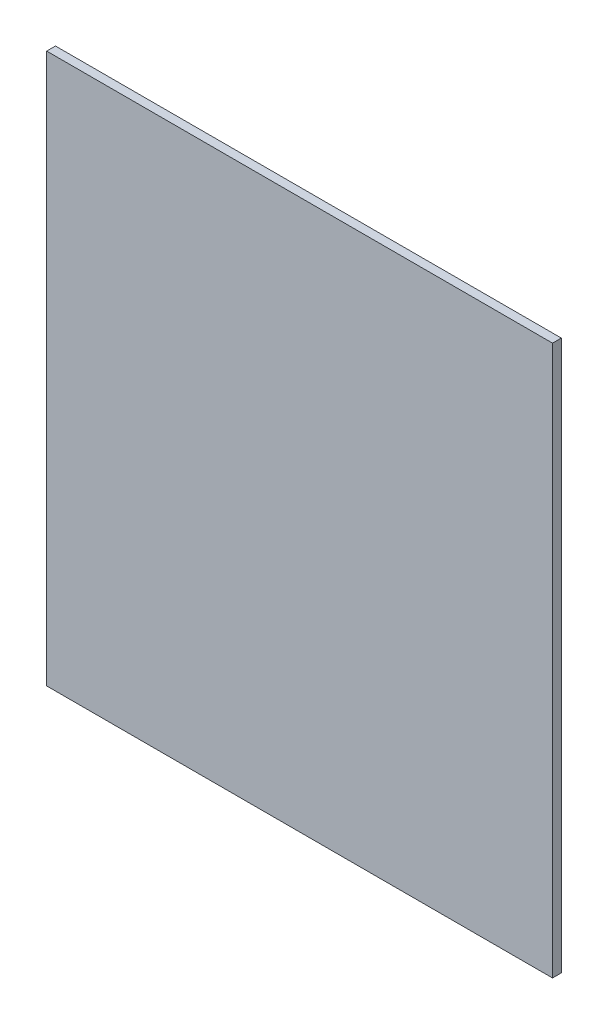
ISO-10303-21;
HEADER;
FILE_DESCRIPTION(('STEP AP214'),'2;1');
FILE_NAME('part.step','',(''),(''),'','','');
FILE_SCHEMA(('AUTOMOTIVE_DESIGN { 1 0 10303 214 1 1 1 1 }'));
ENDSEC;
DATA;
#1=APPLICATION_CONTEXT('core data for automotive mechanical design processes');
#2=APPLICATION_PROTOCOL_DEFINITION('international standard','automotive_design',2000,#1);
#3=PRODUCT_CONTEXT('',#1,'mechanical');
#4=PRODUCT('Part','Part','',(#3));
#5=PRODUCT_RELATED_PRODUCT_CATEGORY('part','',(#4));
#6=PRODUCT_DEFINITION_FORMATION('','',#4);
#7=PRODUCT_DEFINITION_CONTEXT('part definition',#1,'design');
#8=PRODUCT_DEFINITION('design','',#6,#7);
#9=PRODUCT_DEFINITION_SHAPE('','',#8);
#10=(LENGTH_UNIT() NAMED_UNIT(*) SI_UNIT(.MILLI.,.METRE.));
#11=(NAMED_UNIT(*) PLANE_ANGLE_UNIT() SI_UNIT($,.RADIAN.));
#12=(NAMED_UNIT(*) SI_UNIT($,.STERADIAN.) SOLID_ANGLE_UNIT());
#13=UNCERTAINTY_MEASURE_WITH_UNIT(LENGTH_MEASURE(1.E-05),#10,'distance_accuracy_value','');
#14=(GEOMETRIC_REPRESENTATION_CONTEXT(3) GLOBAL_UNCERTAINTY_ASSIGNED_CONTEXT((#13)) GLOBAL_UNIT_ASSIGNED_CONTEXT((#10,
#11,#12)) REPRESENTATION_CONTEXT('',''));
#15=CARTESIAN_POINT('',(0.,0.,0.));
#16=DIRECTION('',(0.,0.,1.));
#17=DIRECTION('',(1.,0.,0.));
#18=AXIS2_PLACEMENT_3D('',#15,#16,#17);
#19=CARTESIAN_POINT('',(115.,-125.,4.));
#20=DIRECTION('',(-1.,0.,0.));
#21=DIRECTION('',(0.,0.,1.));
#22=AXIS2_PLACEMENT_3D('',#19,#20,#21);
#23=PLANE('',#22);
#24=DIRECTION('',(0.,1.,0.));
#25=VECTOR('',#24,1.);
#26=CARTESIAN_POINT('',(115.,-125.,0.));
#27=LINE('',#26,#25);
#28=CARTESIAN_POINT('',(115.,-125.,0.));
#29=VERTEX_POINT('',#28);
#30=CARTESIAN_POINT('',(115.,125.,0.));
#31=VERTEX_POINT('',#30);
#32=EDGE_CURVE('E96',#29,#31,#27,.T.);
#33=ORIENTED_EDGE('',*,*,#32,.T.);
#34=DIRECTION('',(0.,0.,-1.));
#35=VECTOR('',#34,1.);
#36=CARTESIAN_POINT('',(115.,125.,4.));
#37=LINE('',#36,#35);
#38=CARTESIAN_POINT('',(115.,125.,4.));
#39=VERTEX_POINT('',#38);
#40=EDGE_CURVE('E11',#39,#31,#37,.T.);
#41=ORIENTED_EDGE('',*,*,#40,.F.);
#42=DIRECTION('',(0.,1.,0.));
#43=VECTOR('',#42,1.);
#44=CARTESIAN_POINT('',(115.,-125.,4.));
#45=LINE('',#44,#43);
#46=CARTESIAN_POINT('',(115.,-125.,4.));
#47=VERTEX_POINT('',#46);
#48=EDGE_CURVE('E84',#47,#39,#45,.T.);
#49=ORIENTED_EDGE('',*,*,#48,.F.);
#50=DIRECTION('',(0.,0.,-1.));
#51=VECTOR('',#50,1.);
#52=CARTESIAN_POINT('',(115.,-125.,4.));
#53=LINE('',#52,#51);
#54=EDGE_CURVE('E92',#47,#29,#53,.T.);
#55=ORIENTED_EDGE('',*,*,#54,.T.);
#56=EDGE_LOOP('',(#33,#41,#49,#55));
#57=FACE_BOUND('',#56,.T.);
#58=ADVANCED_FACE('F33',(#57),#23,.F.);
#59=CARTESIAN_POINT('',(-115.,125.,4.));
#60=DIRECTION('',(0.,-1.,0.));
#61=DIRECTION('',(0.,0.,-1.));
#62=AXIS2_PLACEMENT_3D('',#59,#60,#61);
#63=PLANE('',#62);
#64=DIRECTION('',(-1.,0.,0.));
#65=VECTOR('',#64,1.);
#66=CARTESIAN_POINT('',(-115.,125.,0.));
#67=LINE('',#66,#65);
#68=CARTESIAN_POINT('',(-115.,125.,0.));
#69=VERTEX_POINT('',#68);
#70=EDGE_CURVE('E88',#31,#69,#67,.T.);
#71=ORIENTED_EDGE('',*,*,#70,.T.);
#72=DIRECTION('',(0.,0.,-1.));
#73=VECTOR('',#72,1.);
#74=CARTESIAN_POINT('',(-115.,125.,4.));
#75=LINE('',#74,#73);
#76=CARTESIAN_POINT('',(-115.,125.,4.));
#77=VERTEX_POINT('',#76);
#78=EDGE_CURVE('E41',#77,#69,#75,.T.);
#79=ORIENTED_EDGE('',*,*,#78,.F.);
#80=DIRECTION('',(-1.,0.,0.));
#81=VECTOR('',#80,1.);
#82=CARTESIAN_POINT('',(-115.,125.,4.));
#83=LINE('',#82,#81);
#84=EDGE_CURVE('E79',#39,#77,#83,.T.);
#85=ORIENTED_EDGE('',*,*,#84,.F.);
#86=ORIENTED_EDGE('',*,*,#40,.T.);
#87=EDGE_LOOP('',(#71,#79,#85,#86));
#88=FACE_BOUND('',#87,.T.);
#89=ADVANCED_FACE('F87',(#88),#63,.F.);
#90=CARTESIAN_POINT('',(-115.,-125.,4.));
#91=DIRECTION('',(1.,0.,0.));
#92=DIRECTION('',(0.,0.,-1.));
#93=AXIS2_PLACEMENT_3D('',#90,#91,#92);
#94=PLANE('',#93);
#95=DIRECTION('',(0.,-1.,0.));
#96=VECTOR('',#95,1.);
#97=CARTESIAN_POINT('',(-115.,-125.,0.));
#98=LINE('',#97,#96);
#99=CARTESIAN_POINT('',(-115.,-125.,0.));
#100=VERTEX_POINT('',#99);
#101=EDGE_CURVE('E66',#69,#100,#98,.T.);
#102=ORIENTED_EDGE('',*,*,#101,.T.);
#103=DIRECTION('',(0.,0.,-1.));
#104=VECTOR('',#103,1.);
#105=CARTESIAN_POINT('',(-115.,-125.,4.));
#106=LINE('',#105,#104);
#107=CARTESIAN_POINT('',(-115.,-125.,4.));
#108=VERTEX_POINT('',#107);
#109=EDGE_CURVE('E89',#108,#100,#106,.T.);
#110=ORIENTED_EDGE('',*,*,#109,.F.);
#111=DIRECTION('',(0.,-1.,0.));
#112=VECTOR('',#111,1.);
#113=CARTESIAN_POINT('',(-115.,-125.,4.));
#114=LINE('',#113,#112);
#115=EDGE_CURVE('E82',#77,#108,#114,.T.);
#116=ORIENTED_EDGE('',*,*,#115,.F.);
#117=ORIENTED_EDGE('',*,*,#78,.T.);
#118=EDGE_LOOP('',(#102,#110,#116,#117));
#119=FACE_BOUND('',#118,.T.);
#120=ADVANCED_FACE('F90',(#119),#94,.F.);
#121=CARTESIAN_POINT('',(-115.,-125.,4.));
#122=DIRECTION('',(0.,1.,0.));
#123=DIRECTION('',(0.,0.,1.));
#124=AXIS2_PLACEMENT_3D('',#121,#122,#123);
#125=PLANE('',#124);
#126=DIRECTION('',(1.,0.,0.));
#127=VECTOR('',#126,1.);
#128=CARTESIAN_POINT('',(-115.,-125.,0.));
#129=LINE('',#128,#127);
#130=EDGE_CURVE('E72',#100,#29,#129,.T.);
#131=ORIENTED_EDGE('',*,*,#130,.T.);
#132=ORIENTED_EDGE('',*,*,#54,.F.);
#133=DIRECTION('',(1.,0.,0.));
#134=VECTOR('',#133,1.);
#135=CARTESIAN_POINT('',(-115.,-125.,4.));
#136=LINE('',#135,#134);
#137=EDGE_CURVE('E49',#108,#47,#136,.T.);
#138=ORIENTED_EDGE('',*,*,#137,.F.);
#139=ORIENTED_EDGE('',*,*,#109,.T.);
#140=EDGE_LOOP('',(#131,#132,#138,#139));
#141=FACE_BOUND('',#140,.T.);
#142=ADVANCED_FACE('F103',(#141),#125,.F.);
#143=CARTESIAN_POINT('',(0.,0.,4.));
#144=DIRECTION('',(0.,0.,-1.));
#145=DIRECTION('',(-1.,0.,0.));
#146=AXIS2_PLACEMENT_3D('',#143,#144,#145);
#147=PLANE('',#146);
#148=ORIENTED_EDGE('',*,*,#48,.T.);
#149=ORIENTED_EDGE('',*,*,#84,.T.);
#150=ORIENTED_EDGE('',*,*,#115,.T.);
#151=ORIENTED_EDGE('',*,*,#137,.T.);
#152=EDGE_LOOP('',(#148,#149,#150,#151));
#153=FACE_BOUND('',#152,.T.);
#154=ADVANCED_FACE('F80',(#153),#147,.F.);
#155=CARTESIAN_POINT('',(0.,0.,0.));
#156=DIRECTION('',(0.,0.,-1.));
#157=DIRECTION('',(-1.,0.,0.));
#158=AXIS2_PLACEMENT_3D('',#155,#156,#157);
#159=PLANE('',#158);
#160=ORIENTED_EDGE('',*,*,#32,.F.);
#161=ORIENTED_EDGE('',*,*,#130,.F.);
#162=ORIENTED_EDGE('',*,*,#101,.F.);
#163=ORIENTED_EDGE('',*,*,#70,.F.);
#164=EDGE_LOOP('',(#160,#161,#162,#163));
#165=FACE_BOUND('',#164,.T.);
#166=ADVANCED_FACE('F106',(#165),#159,.T.);
#167=CLOSED_SHELL('',(#58,#89,#120,#142,#154,#166));
#168=MANIFOLD_SOLID_BREP('B2',#167);
#169=ADVANCED_BREP_SHAPE_REPRESENTATION('',(#18,#168),#14);
#170=SHAPE_DEFINITION_REPRESENTATION(#9,#169);
ENDSEC;
END-ISO-10303-21;
